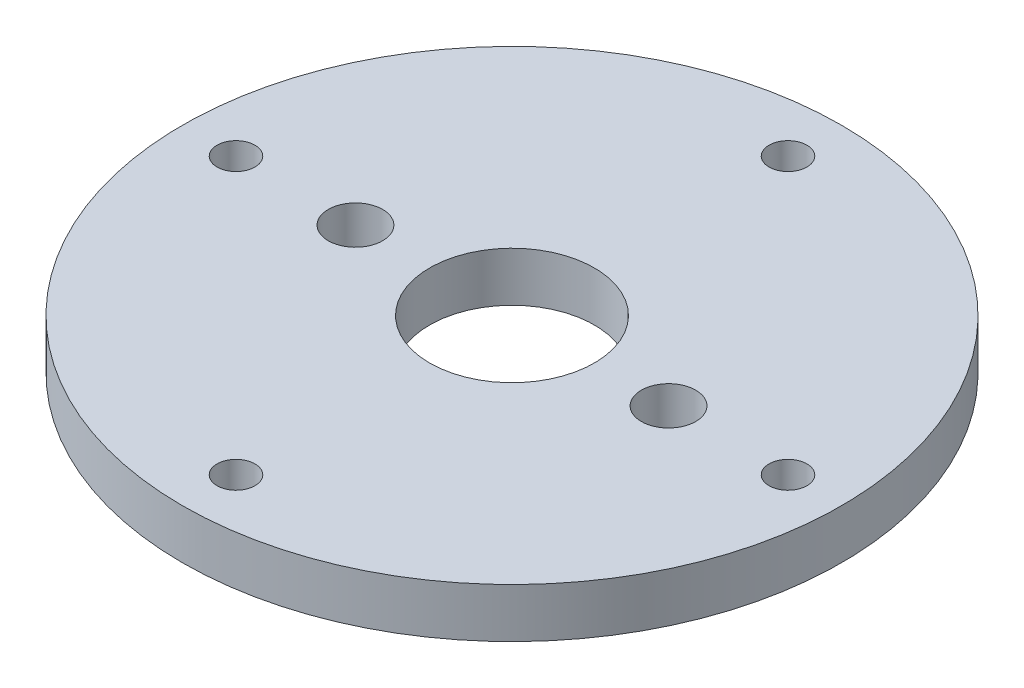
ISO-10303-21;
HEADER;
FILE_DESCRIPTION(('STEP AP214'),'2;1');
FILE_NAME('part.step','',(''),(''),'','','');
FILE_SCHEMA(('AUTOMOTIVE_DESIGN { 1 0 10303 214 1 1 1 1 }'));
ENDSEC;
DATA;
#1=APPLICATION_CONTEXT('core data for automotive mechanical design processes');
#2=APPLICATION_PROTOCOL_DEFINITION('international standard','automotive_design',2000,#1);
#3=PRODUCT_CONTEXT('',#1,'mechanical');
#4=PRODUCT('Part','Part','',(#3));
#5=PRODUCT_RELATED_PRODUCT_CATEGORY('part','',(#4));
#6=PRODUCT_DEFINITION_FORMATION('','',#4);
#7=PRODUCT_DEFINITION_CONTEXT('part definition',#1,'design');
#8=PRODUCT_DEFINITION('design','',#6,#7);
#9=PRODUCT_DEFINITION_SHAPE('','',#8);
#10=(LENGTH_UNIT() NAMED_UNIT(*) SI_UNIT(.MILLI.,.METRE.));
#11=(NAMED_UNIT(*) PLANE_ANGLE_UNIT() SI_UNIT($,.RADIAN.));
#12=(NAMED_UNIT(*) SI_UNIT($,.STERADIAN.) SOLID_ANGLE_UNIT());
#13=UNCERTAINTY_MEASURE_WITH_UNIT(LENGTH_MEASURE(1.E-05),#10,'distance_accuracy_value','');
#14=(GEOMETRIC_REPRESENTATION_CONTEXT(3) GLOBAL_UNCERTAINTY_ASSIGNED_CONTEXT((#13)) GLOBAL_UNIT_ASSIGNED_CONTEXT((#10,
#11,#12)) REPRESENTATION_CONTEXT('',''));
#15=CARTESIAN_POINT('',(0.,0.,0.));
#16=DIRECTION('',(0.,0.,1.));
#17=DIRECTION('',(1.,0.,0.));
#18=AXIS2_PLACEMENT_3D('',#15,#16,#17);
#19=CARTESIAN_POINT('',(0.,3.,0.));
#20=DIRECTION('',(0.,-1.,0.));
#21=DIRECTION('',(0.,0.,-1.));
#22=AXIS2_PLACEMENT_3D('',#19,#20,#21);
#23=CYLINDRICAL_SURFACE('',#22,20.);
#24=CARTESIAN_POINT('',(0.,3.,0.));
#25=DIRECTION('',(0.,1.,0.));
#26=DIRECTION('',(0.,0.,1.));
#27=AXIS2_PLACEMENT_3D('',#24,#25,#26);
#28=CIRCLE('',#27,20.);
#29=CARTESIAN_POINT('',(0.,3.,20.));
#30=VERTEX_POINT('',#29);
#31=EDGE_CURVE('E10',#30,#30,#28,.T.);
#32=ORIENTED_EDGE('',*,*,#31,.F.);
#33=EDGE_LOOP('',(#32));
#34=FACE_BOUND('',#33,.T.);
#35=CARTESIAN_POINT('',(0.,0.,0.));
#36=DIRECTION('',(0.,1.,0.));
#37=DIRECTION('',(0.,0.,1.));
#38=AXIS2_PLACEMENT_3D('',#35,#36,#37);
#39=CIRCLE('',#38,20.);
#40=CARTESIAN_POINT('',(0.,0.,20.));
#41=VERTEX_POINT('',#40);
#42=EDGE_CURVE('E36',#41,#41,#39,.T.);
#43=ORIENTED_EDGE('',*,*,#42,.T.);
#44=EDGE_LOOP('',(#43));
#45=FACE_BOUND('',#44,.T.);
#46=ADVANCED_FACE('F33',(#34,#45),#23,.T.);
#47=CARTESIAN_POINT('',(0.,3.,0.));
#48=DIRECTION('',(0.,1.,0.));
#49=DIRECTION('',(0.,0.,1.));
#50=AXIS2_PLACEMENT_3D('',#47,#48,#49);
#51=PLANE('',#50);
#52=CARTESIAN_POINT('',(-9.5,3.,0.));
#53=DIRECTION('',(0.,1.,0.));
#54=DIRECTION('',(0.,0.,1.));
#55=AXIS2_PLACEMENT_3D('',#52,#53,#54);
#56=CIRCLE('',#55,1.65);
#57=CARTESIAN_POINT('',(-9.5,3.,1.65));
#58=VERTEX_POINT('',#57);
#59=EDGE_CURVE('E79',#58,#58,#56,.T.);
#60=ORIENTED_EDGE('',*,*,#59,.F.);
#61=EDGE_LOOP('',(#60));
#62=FACE_BOUND('',#61,.T.);
#63=CARTESIAN_POINT('',(9.5,3.,0.));
#64=DIRECTION('',(0.,1.,0.));
#65=DIRECTION('',(0.,0.,1.));
#66=AXIS2_PLACEMENT_3D('',#63,#64,#65);
#67=CIRCLE('',#66,1.65);
#68=CARTESIAN_POINT('',(9.5,3.,1.65));
#69=VERTEX_POINT('',#68);
#70=EDGE_CURVE('E72',#69,#69,#67,.T.);
#71=ORIENTED_EDGE('',*,*,#70,.F.);
#72=EDGE_LOOP('',(#71));
#73=FACE_BOUND('',#72,.T.);
#74=CARTESIAN_POINT('',(0.,3.,0.));
#75=DIRECTION('',(0.,1.,0.));
#76=DIRECTION('',(0.,0.,1.));
#77=AXIS2_PLACEMENT_3D('',#74,#75,#76);
#78=CIRCLE('',#77,5.);
#79=CARTESIAN_POINT('',(0.,3.,5.));
#80=VERTEX_POINT('',#79);
#81=EDGE_CURVE('E73',#80,#80,#78,.T.);
#82=ORIENTED_EDGE('',*,*,#81,.F.);
#83=EDGE_LOOP('',(#82));
#84=FACE_BOUND('',#83,.T.);
#85=CARTESIAN_POINT('',(0.,3.,-16.75));
#86=DIRECTION('',(0.,1.,0.));
#87=DIRECTION('',(0.,0.,1.));
#88=AXIS2_PLACEMENT_3D('',#85,#86,#87);
#89=CIRCLE('',#88,1.15);
#90=CARTESIAN_POINT('',(0.,3.,-15.6));
#91=VERTEX_POINT('',#90);
#92=EDGE_CURVE('E62',#91,#91,#89,.T.);
#93=ORIENTED_EDGE('',*,*,#92,.F.);
#94=EDGE_LOOP('',(#93));
#95=FACE_BOUND('',#94,.T.);
#96=CARTESIAN_POINT('',(16.75,3.,0.));
#97=DIRECTION('',(0.,1.,0.));
#98=DIRECTION('',(0.,0.,1.));
#99=AXIS2_PLACEMENT_3D('',#96,#97,#98);
#100=CIRCLE('',#99,1.15);
#101=CARTESIAN_POINT('',(16.75,3.,1.15));
#102=VERTEX_POINT('',#101);
#103=EDGE_CURVE('E56',#102,#102,#100,.T.);
#104=ORIENTED_EDGE('',*,*,#103,.F.);
#105=EDGE_LOOP('',(#104));
#106=FACE_BOUND('',#105,.T.);
#107=CARTESIAN_POINT('',(0.,3.,16.75));
#108=DIRECTION('',(0.,1.,0.));
#109=DIRECTION('',(0.,0.,1.));
#110=AXIS2_PLACEMENT_3D('',#107,#108,#109);
#111=CIRCLE('',#110,1.15);
#112=CARTESIAN_POINT('',(0.,3.,17.9));
#113=VERTEX_POINT('',#112);
#114=EDGE_CURVE('E48',#113,#113,#111,.T.);
#115=ORIENTED_EDGE('',*,*,#114,.F.);
#116=EDGE_LOOP('',(#115));
#117=FACE_BOUND('',#116,.T.);
#118=CARTESIAN_POINT('',(-16.75,3.,0.));
#119=DIRECTION('',(0.,1.,0.));
#120=DIRECTION('',(0.,0.,1.));
#121=AXIS2_PLACEMENT_3D('',#118,#119,#120);
#122=CIRCLE('',#121,1.15);
#123=CARTESIAN_POINT('',(-16.75,3.,1.15));
#124=VERTEX_POINT('',#123);
#125=EDGE_CURVE('E49',#124,#124,#122,.T.);
#126=ORIENTED_EDGE('',*,*,#125,.F.);
#127=EDGE_LOOP('',(#126));
#128=FACE_BOUND('',#127,.T.);
#129=ORIENTED_EDGE('',*,*,#31,.T.);
#130=EDGE_LOOP('',(#129));
#131=FACE_BOUND('',#130,.T.);
#132=ADVANCED_FACE('F90',(#62,#73,#84,#95,#106,#117,#128,#131),#51,.T.);
#133=CARTESIAN_POINT('',(0.,0.,0.));
#134=DIRECTION('',(0.,1.,0.));
#135=DIRECTION('',(0.,0.,1.));
#136=AXIS2_PLACEMENT_3D('',#133,#134,#135);
#137=PLANE('',#136);
#138=CARTESIAN_POINT('',(-9.5,0.,0.));
#139=DIRECTION('',(0.,1.,0.));
#140=DIRECTION('',(0.,0.,1.));
#141=AXIS2_PLACEMENT_3D('',#138,#139,#140);
#142=CIRCLE('',#141,1.65);
#143=CARTESIAN_POINT('',(-9.5,0.,1.65));
#144=VERTEX_POINT('',#143);
#145=EDGE_CURVE('E52',#144,#144,#142,.F.);
#146=ORIENTED_EDGE('',*,*,#145,.F.);
#147=EDGE_LOOP('',(#146));
#148=FACE_BOUND('',#147,.T.);
#149=CARTESIAN_POINT('',(9.5,0.,0.));
#150=DIRECTION('',(0.,1.,0.));
#151=DIRECTION('',(0.,0.,1.));
#152=AXIS2_PLACEMENT_3D('',#149,#150,#151);
#153=CIRCLE('',#152,1.65);
#154=CARTESIAN_POINT('',(9.5,0.,1.65));
#155=VERTEX_POINT('',#154);
#156=EDGE_CURVE('E76',#155,#155,#153,.F.);
#157=ORIENTED_EDGE('',*,*,#156,.F.);
#158=EDGE_LOOP('',(#157));
#159=FACE_BOUND('',#158,.T.);
#160=CARTESIAN_POINT('',(0.,0.,0.));
#161=DIRECTION('',(0.,1.,0.));
#162=DIRECTION('',(0.,0.,1.));
#163=AXIS2_PLACEMENT_3D('',#160,#161,#162);
#164=CIRCLE('',#163,5.);
#165=CARTESIAN_POINT('',(0.,0.,5.));
#166=VERTEX_POINT('',#165);
#167=EDGE_CURVE('E69',#166,#166,#164,.F.);
#168=ORIENTED_EDGE('',*,*,#167,.F.);
#169=EDGE_LOOP('',(#168));
#170=FACE_BOUND('',#169,.T.);
#171=CARTESIAN_POINT('',(0.,0.,-16.75));
#172=DIRECTION('',(0.,1.,0.));
#173=DIRECTION('',(0.,0.,1.));
#174=AXIS2_PLACEMENT_3D('',#171,#172,#173);
#175=CIRCLE('',#174,1.15);
#176=CARTESIAN_POINT('',(0.,0.,-15.6));
#177=VERTEX_POINT('',#176);
#178=EDGE_CURVE('E43',#177,#177,#175,.F.);
#179=ORIENTED_EDGE('',*,*,#178,.F.);
#180=EDGE_LOOP('',(#179));
#181=FACE_BOUND('',#180,.T.);
#182=CARTESIAN_POINT('',(16.75,0.,0.));
#183=DIRECTION('',(0.,1.,0.));
#184=DIRECTION('',(0.,0.,1.));
#185=AXIS2_PLACEMENT_3D('',#182,#183,#184);
#186=CIRCLE('',#185,1.15);
#187=CARTESIAN_POINT('',(16.75,0.,1.15));
#188=VERTEX_POINT('',#187);
#189=EDGE_CURVE('E59',#188,#188,#186,.F.);
#190=ORIENTED_EDGE('',*,*,#189,.F.);
#191=EDGE_LOOP('',(#190));
#192=FACE_BOUND('',#191,.T.);
#193=CARTESIAN_POINT('',(0.,0.,16.75));
#194=DIRECTION('',(0.,1.,0.));
#195=DIRECTION('',(0.,0.,1.));
#196=AXIS2_PLACEMENT_3D('',#193,#194,#195);
#197=CIRCLE('',#196,1.15);
#198=CARTESIAN_POINT('',(0.,0.,17.9));
#199=VERTEX_POINT('',#198);
#200=EDGE_CURVE('E53',#199,#199,#197,.F.);
#201=ORIENTED_EDGE('',*,*,#200,.F.);
#202=EDGE_LOOP('',(#201));
#203=FACE_BOUND('',#202,.T.);
#204=CARTESIAN_POINT('',(-16.75,0.,0.));
#205=DIRECTION('',(0.,1.,0.));
#206=DIRECTION('',(0.,0.,1.));
#207=AXIS2_PLACEMENT_3D('',#204,#205,#206);
#208=CIRCLE('',#207,1.15);
#209=CARTESIAN_POINT('',(-16.75,0.,1.15));
#210=VERTEX_POINT('',#209);
#211=EDGE_CURVE('E45',#210,#210,#208,.F.);
#212=ORIENTED_EDGE('',*,*,#211,.F.);
#213=EDGE_LOOP('',(#212));
#214=FACE_BOUND('',#213,.T.);
#215=ORIENTED_EDGE('',*,*,#42,.F.);
#216=EDGE_LOOP('',(#215));
#217=FACE_BOUND('',#216,.T.);
#218=ADVANCED_FACE('F93',(#148,#159,#170,#181,#192,#203,#214,#217),#137,.F.);
#219=CARTESIAN_POINT('',(-16.75,-0.00100000000000013,0.));
#220=DIRECTION('',(0.,1.,0.));
#221=DIRECTION('',(0.,0.,1.));
#222=AXIS2_PLACEMENT_3D('',#219,#220,#221);
#223=CYLINDRICAL_SURFACE('',#222,1.15);
#224=CARTESIAN_POINT('',(-16.75,3.,1.15));
#225=CARTESIAN_POINT('',(-16.75,2.96875,1.15));
#226=CARTESIAN_POINT('',(-16.75,2.9375,1.15));
#227=CARTESIAN_POINT('',(-16.75,2.875,1.15));
#228=CARTESIAN_POINT('',(-16.75,2.84375,1.15));
#229=CARTESIAN_POINT('',(-16.75,2.78125,1.15));
#230=CARTESIAN_POINT('',(-16.75,2.75,1.15));
#231=CARTESIAN_POINT('',(-16.75,2.6875,1.15));
#232=CARTESIAN_POINT('',(-16.75,2.65625,1.15));
#233=CARTESIAN_POINT('',(-16.75,2.59375,1.15));
#234=CARTESIAN_POINT('',(-16.75,2.5625,1.15));
#235=CARTESIAN_POINT('',(-16.75,2.5,1.15));
#236=CARTESIAN_POINT('',(-16.75,2.46875,1.15));
#237=CARTESIAN_POINT('',(-16.75,2.40625,1.15));
#238=CARTESIAN_POINT('',(-16.75,2.375,1.15));
#239=CARTESIAN_POINT('',(-16.75,2.3125,1.15));
#240=CARTESIAN_POINT('',(-16.75,2.28125,1.15));
#241=CARTESIAN_POINT('',(-16.75,2.21875,1.15));
#242=CARTESIAN_POINT('',(-16.75,2.1875,1.15));
#243=CARTESIAN_POINT('',(-16.75,2.125,1.15));
#244=CARTESIAN_POINT('',(-16.75,2.09375,1.15));
#245=CARTESIAN_POINT('',(-16.75,2.03125,1.15));
#246=CARTESIAN_POINT('',(-16.75,2.,1.15));
#247=CARTESIAN_POINT('',(-16.75,1.9375,1.15));
#248=CARTESIAN_POINT('',(-16.75,1.90625,1.15));
#249=CARTESIAN_POINT('',(-16.75,1.84375,1.15));
#250=CARTESIAN_POINT('',(-16.75,1.8125,1.15));
#251=CARTESIAN_POINT('',(-16.75,1.75,1.15));
#252=CARTESIAN_POINT('',(-16.75,1.71875,1.15));
#253=CARTESIAN_POINT('',(-16.75,1.65625,1.15));
#254=CARTESIAN_POINT('',(-16.75,1.625,1.15));
#255=CARTESIAN_POINT('',(-16.75,1.5625,1.15));
#256=CARTESIAN_POINT('',(-16.75,1.53125,1.15));
#257=CARTESIAN_POINT('',(-16.75,1.46875,1.15));
#258=CARTESIAN_POINT('',(-16.75,1.4375,1.15));
#259=CARTESIAN_POINT('',(-16.75,1.375,1.15));
#260=CARTESIAN_POINT('',(-16.75,1.34375,1.15));
#261=CARTESIAN_POINT('',(-16.75,1.28125,1.15));
#262=CARTESIAN_POINT('',(-16.75,1.25,1.15));
#263=CARTESIAN_POINT('',(-16.75,1.1875,1.15));
#264=CARTESIAN_POINT('',(-16.75,1.15625,1.15));
#265=CARTESIAN_POINT('',(-16.75,1.09375,1.15));
#266=CARTESIAN_POINT('',(-16.75,1.0625,1.15));
#267=CARTESIAN_POINT('',(-16.75,1.,1.15));
#268=CARTESIAN_POINT('',(-16.75,0.96875,1.15));
#269=CARTESIAN_POINT('',(-16.75,0.90625,1.15));
#270=CARTESIAN_POINT('',(-16.75,0.875,1.15));
#271=CARTESIAN_POINT('',(-16.75,0.8125,1.15));
#272=CARTESIAN_POINT('',(-16.75,0.78125,1.15));
#273=CARTESIAN_POINT('',(-16.75,0.71875,1.15));
#274=CARTESIAN_POINT('',(-16.75,0.6875,1.15));
#275=CARTESIAN_POINT('',(-16.75,0.625,1.15));
#276=CARTESIAN_POINT('',(-16.75,0.59375,1.15));
#277=CARTESIAN_POINT('',(-16.75,0.53125,1.15));
#278=CARTESIAN_POINT('',(-16.75,0.5,1.15));
#279=CARTESIAN_POINT('',(-16.75,0.4375,1.15));
#280=CARTESIAN_POINT('',(-16.75,0.40625,1.15));
#281=CARTESIAN_POINT('',(-16.75,0.34375,1.15));
#282=CARTESIAN_POINT('',(-16.75,0.3125,1.15));
#283=CARTESIAN_POINT('',(-16.75,0.25,1.15));
#284=CARTESIAN_POINT('',(-16.75,0.21875,1.15));
#285=CARTESIAN_POINT('',(-16.75,0.15625,1.15));
#286=CARTESIAN_POINT('',(-16.75,0.125,1.15));
#287=CARTESIAN_POINT('',(-16.75,0.0625000000000001,1.15));
#288=CARTESIAN_POINT('',(-16.75,0.0312500000000001,1.15));
#289=CARTESIAN_POINT('',(-16.75,0.,1.15));
#290=B_SPLINE_CURVE_WITH_KNOTS('',3,(#224,#225,#226,#227,#228,#229,#230,#231,#232,#233,#234,
#235,#236,#237,#238,#239,#240,#241,#242,#243,#244,#245,#246,#247,#248,#249,#250,#251,#252,#253,
#254,#255,#256,#257,#258,#259,#260,#261,#262,#263,#264,#265,#266,#267,#268,#269,#270,#271,#272,
#273,#274,#275,#276,#277,#278,#279,#280,#281,#282,#283,#284,#285,#286,#287,#288,#289),
.UNSPECIFIED.,.F.,.F.,(4,2,2,2,2,2,2,2,2,2,2,2,2,2,2,2,2,2,2,2,2,2,2,2,2,2,2,2,2,2,2,2,4),(0.,
0.0937500000000001,0.1875,0.28125,0.375,0.46875,0.5625,0.65625,0.75,0.84375,0.9375,1.03125,
1.125,1.21875,1.3125,1.40625,1.5,1.59375,1.6875,1.78125,1.875,1.96875,2.0625,2.15625,2.25,
2.34375,2.4375,2.53125,2.625,2.71875,2.8125,2.90625,3.),.UNSPECIFIED.);
#291=EDGE_CURVE('BSEAM107',#124,#210,#290,.T.);
#292=ORIENTED_EDGE('',*,*,#125,.T.);
#293=ORIENTED_EDGE('',*,*,#211,.T.);
#294=ORIENTED_EDGE('',*,*,#291,.T.);
#295=ORIENTED_EDGE('',*,*,#291,.F.);
#296=EDGE_LOOP('',(#292,#294,#293,#295));
#297=FACE_BOUND('',#296,.T.);
#298=ADVANCED_FACE('F107',(#297),#223,.F.);
#299=CARTESIAN_POINT('',(0.,-0.00100000000000013,16.75));
#300=DIRECTION('',(0.,1.,0.));
#301=DIRECTION('',(0.,0.,1.));
#302=AXIS2_PLACEMENT_3D('',#299,#300,#301);
#303=CYLINDRICAL_SURFACE('',#302,1.15);
#304=CARTESIAN_POINT('',(0.,3.,17.9));
#305=CARTESIAN_POINT('',(0.,2.96875,17.9));
#306=CARTESIAN_POINT('',(0.,2.9375,17.9));
#307=CARTESIAN_POINT('',(0.,2.875,17.9));
#308=CARTESIAN_POINT('',(0.,2.84375,17.9));
#309=CARTESIAN_POINT('',(0.,2.78125,17.9));
#310=CARTESIAN_POINT('',(0.,2.75,17.9));
#311=CARTESIAN_POINT('',(0.,2.6875,17.9));
#312=CARTESIAN_POINT('',(0.,2.65625,17.9));
#313=CARTESIAN_POINT('',(0.,2.59375,17.9));
#314=CARTESIAN_POINT('',(0.,2.5625,17.9));
#315=CARTESIAN_POINT('',(0.,2.5,17.9));
#316=CARTESIAN_POINT('',(0.,2.46875,17.9));
#317=CARTESIAN_POINT('',(0.,2.40625,17.9));
#318=CARTESIAN_POINT('',(0.,2.375,17.9));
#319=CARTESIAN_POINT('',(0.,2.3125,17.9));
#320=CARTESIAN_POINT('',(0.,2.28125,17.9));
#321=CARTESIAN_POINT('',(0.,2.21875,17.9));
#322=CARTESIAN_POINT('',(0.,2.1875,17.9));
#323=CARTESIAN_POINT('',(0.,2.125,17.9));
#324=CARTESIAN_POINT('',(0.,2.09375,17.9));
#325=CARTESIAN_POINT('',(0.,2.03125,17.9));
#326=CARTESIAN_POINT('',(0.,2.,17.9));
#327=CARTESIAN_POINT('',(0.,1.9375,17.9));
#328=CARTESIAN_POINT('',(0.,1.90625,17.9));
#329=CARTESIAN_POINT('',(0.,1.84375,17.9));
#330=CARTESIAN_POINT('',(0.,1.8125,17.9));
#331=CARTESIAN_POINT('',(0.,1.75,17.9));
#332=CARTESIAN_POINT('',(0.,1.71875,17.9));
#333=CARTESIAN_POINT('',(0.,1.65625,17.9));
#334=CARTESIAN_POINT('',(0.,1.625,17.9));
#335=CARTESIAN_POINT('',(0.,1.5625,17.9));
#336=CARTESIAN_POINT('',(0.,1.53125,17.9));
#337=CARTESIAN_POINT('',(0.,1.46875,17.9));
#338=CARTESIAN_POINT('',(0.,1.4375,17.9));
#339=CARTESIAN_POINT('',(0.,1.375,17.9));
#340=CARTESIAN_POINT('',(0.,1.34375,17.9));
#341=CARTESIAN_POINT('',(0.,1.28125,17.9));
#342=CARTESIAN_POINT('',(0.,1.25,17.9));
#343=CARTESIAN_POINT('',(0.,1.1875,17.9));
#344=CARTESIAN_POINT('',(0.,1.15625,17.9));
#345=CARTESIAN_POINT('',(0.,1.09375,17.9));
#346=CARTESIAN_POINT('',(0.,1.0625,17.9));
#347=CARTESIAN_POINT('',(0.,1.,17.9));
#348=CARTESIAN_POINT('',(0.,0.96875,17.9));
#349=CARTESIAN_POINT('',(0.,0.90625,17.9));
#350=CARTESIAN_POINT('',(0.,0.875,17.9));
#351=CARTESIAN_POINT('',(0.,0.8125,17.9));
#352=CARTESIAN_POINT('',(0.,0.78125,17.9));
#353=CARTESIAN_POINT('',(0.,0.71875,17.9));
#354=CARTESIAN_POINT('',(0.,0.6875,17.9));
#355=CARTESIAN_POINT('',(0.,0.625,17.9));
#356=CARTESIAN_POINT('',(0.,0.59375,17.9));
#357=CARTESIAN_POINT('',(0.,0.53125,17.9));
#358=CARTESIAN_POINT('',(0.,0.5,17.9));
#359=CARTESIAN_POINT('',(0.,0.4375,17.9));
#360=CARTESIAN_POINT('',(0.,0.40625,17.9));
#361=CARTESIAN_POINT('',(0.,0.34375,17.9));
#362=CARTESIAN_POINT('',(0.,0.3125,17.9));
#363=CARTESIAN_POINT('',(0.,0.25,17.9));
#364=CARTESIAN_POINT('',(0.,0.21875,17.9));
#365=CARTESIAN_POINT('',(0.,0.15625,17.9));
#366=CARTESIAN_POINT('',(0.,0.125,17.9));
#367=CARTESIAN_POINT('',(0.,0.0625000000000001,17.9));
#368=CARTESIAN_POINT('',(0.,0.0312500000000001,17.9));
#369=CARTESIAN_POINT('',(0.,0.,17.9));
#370=B_SPLINE_CURVE_WITH_KNOTS('',3,(#304,#305,#306,#307,#308,#309,#310,#311,#312,#313,#314,
#315,#316,#317,#318,#319,#320,#321,#322,#323,#324,#325,#326,#327,#328,#329,#330,#331,#332,#333,
#334,#335,#336,#337,#338,#339,#340,#341,#342,#343,#344,#345,#346,#347,#348,#349,#350,#351,#352,
#353,#354,#355,#356,#357,#358,#359,#360,#361,#362,#363,#364,#365,#366,#367,#368,#369),
.UNSPECIFIED.,.F.,.F.,(4,2,2,2,2,2,2,2,2,2,2,2,2,2,2,2,2,2,2,2,2,2,2,2,2,2,2,2,2,2,2,2,4),(0.,
0.0937500000000001,0.1875,0.28125,0.375,0.46875,0.5625,0.65625,0.75,0.84375,0.9375,1.03125,
1.125,1.21875,1.3125,1.40625,1.5,1.59375,1.6875,1.78125,1.875,1.96875,2.0625,2.15625,2.25,
2.34375,2.4375,2.53125,2.625,2.71875,2.8125,2.90625,3.),.UNSPECIFIED.);
#371=EDGE_CURVE('BSEAM110',#113,#199,#370,.T.);
#372=ORIENTED_EDGE('',*,*,#114,.T.);
#373=ORIENTED_EDGE('',*,*,#200,.T.);
#374=ORIENTED_EDGE('',*,*,#371,.T.);
#375=ORIENTED_EDGE('',*,*,#371,.F.);
#376=EDGE_LOOP('',(#372,#374,#373,#375));
#377=FACE_BOUND('',#376,.T.);
#378=ADVANCED_FACE('F110',(#377),#303,.F.);
#379=CARTESIAN_POINT('',(16.75,-0.00100000000000013,0.));
#380=DIRECTION('',(0.,1.,0.));
#381=DIRECTION('',(0.,0.,1.));
#382=AXIS2_PLACEMENT_3D('',#379,#380,#381);
#383=CYLINDRICAL_SURFACE('',#382,1.15);
#384=CARTESIAN_POINT('',(16.75,3.,1.15));
#385=CARTESIAN_POINT('',(16.75,2.96875,1.15));
#386=CARTESIAN_POINT('',(16.75,2.9375,1.15));
#387=CARTESIAN_POINT('',(16.75,2.875,1.15));
#388=CARTESIAN_POINT('',(16.75,2.84375,1.15));
#389=CARTESIAN_POINT('',(16.75,2.78125,1.15));
#390=CARTESIAN_POINT('',(16.75,2.75,1.15));
#391=CARTESIAN_POINT('',(16.75,2.6875,1.15));
#392=CARTESIAN_POINT('',(16.75,2.65625,1.15));
#393=CARTESIAN_POINT('',(16.75,2.59375,1.15));
#394=CARTESIAN_POINT('',(16.75,2.5625,1.15));
#395=CARTESIAN_POINT('',(16.75,2.5,1.15));
#396=CARTESIAN_POINT('',(16.75,2.46875,1.15));
#397=CARTESIAN_POINT('',(16.75,2.40625,1.15));
#398=CARTESIAN_POINT('',(16.75,2.375,1.15));
#399=CARTESIAN_POINT('',(16.75,2.3125,1.15));
#400=CARTESIAN_POINT('',(16.75,2.28125,1.15));
#401=CARTESIAN_POINT('',(16.75,2.21875,1.15));
#402=CARTESIAN_POINT('',(16.75,2.1875,1.15));
#403=CARTESIAN_POINT('',(16.75,2.125,1.15));
#404=CARTESIAN_POINT('',(16.75,2.09375,1.15));
#405=CARTESIAN_POINT('',(16.75,2.03125,1.15));
#406=CARTESIAN_POINT('',(16.75,2.,1.15));
#407=CARTESIAN_POINT('',(16.75,1.9375,1.15));
#408=CARTESIAN_POINT('',(16.75,1.90625,1.15));
#409=CARTESIAN_POINT('',(16.75,1.84375,1.15));
#410=CARTESIAN_POINT('',(16.75,1.8125,1.15));
#411=CARTESIAN_POINT('',(16.75,1.75,1.15));
#412=CARTESIAN_POINT('',(16.75,1.71875,1.15));
#413=CARTESIAN_POINT('',(16.75,1.65625,1.15));
#414=CARTESIAN_POINT('',(16.75,1.625,1.15));
#415=CARTESIAN_POINT('',(16.75,1.5625,1.15));
#416=CARTESIAN_POINT('',(16.75,1.53125,1.15));
#417=CARTESIAN_POINT('',(16.75,1.46875,1.15));
#418=CARTESIAN_POINT('',(16.75,1.4375,1.15));
#419=CARTESIAN_POINT('',(16.75,1.375,1.15));
#420=CARTESIAN_POINT('',(16.75,1.34375,1.15));
#421=CARTESIAN_POINT('',(16.75,1.28125,1.15));
#422=CARTESIAN_POINT('',(16.75,1.25,1.15));
#423=CARTESIAN_POINT('',(16.75,1.1875,1.15));
#424=CARTESIAN_POINT('',(16.75,1.15625,1.15));
#425=CARTESIAN_POINT('',(16.75,1.09375,1.15));
#426=CARTESIAN_POINT('',(16.75,1.0625,1.15));
#427=CARTESIAN_POINT('',(16.75,1.,1.15));
#428=CARTESIAN_POINT('',(16.75,0.96875,1.15));
#429=CARTESIAN_POINT('',(16.75,0.90625,1.15));
#430=CARTESIAN_POINT('',(16.75,0.875,1.15));
#431=CARTESIAN_POINT('',(16.75,0.8125,1.15));
#432=CARTESIAN_POINT('',(16.75,0.78125,1.15));
#433=CARTESIAN_POINT('',(16.75,0.71875,1.15));
#434=CARTESIAN_POINT('',(16.75,0.6875,1.15));
#435=CARTESIAN_POINT('',(16.75,0.625,1.15));
#436=CARTESIAN_POINT('',(16.75,0.59375,1.15));
#437=CARTESIAN_POINT('',(16.75,0.53125,1.15));
#438=CARTESIAN_POINT('',(16.75,0.5,1.15));
#439=CARTESIAN_POINT('',(16.75,0.4375,1.15));
#440=CARTESIAN_POINT('',(16.75,0.40625,1.15));
#441=CARTESIAN_POINT('',(16.75,0.34375,1.15));
#442=CARTESIAN_POINT('',(16.75,0.3125,1.15));
#443=CARTESIAN_POINT('',(16.75,0.25,1.15));
#444=CARTESIAN_POINT('',(16.75,0.21875,1.15));
#445=CARTESIAN_POINT('',(16.75,0.15625,1.15));
#446=CARTESIAN_POINT('',(16.75,0.125,1.15));
#447=CARTESIAN_POINT('',(16.75,0.0625000000000001,1.15));
#448=CARTESIAN_POINT('',(16.75,0.0312500000000001,1.15));
#449=CARTESIAN_POINT('',(16.75,0.,1.15));
#450=B_SPLINE_CURVE_WITH_KNOTS('',3,(#384,#385,#386,#387,#388,#389,#390,#391,#392,#393,#394,
#395,#396,#397,#398,#399,#400,#401,#402,#403,#404,#405,#406,#407,#408,#409,#410,#411,#412,#413,
#414,#415,#416,#417,#418,#419,#420,#421,#422,#423,#424,#425,#426,#427,#428,#429,#430,#431,#432,
#433,#434,#435,#436,#437,#438,#439,#440,#441,#442,#443,#444,#445,#446,#447,#448,#449),
.UNSPECIFIED.,.F.,.F.,(4,2,2,2,2,2,2,2,2,2,2,2,2,2,2,2,2,2,2,2,2,2,2,2,2,2,2,2,2,2,2,2,4),(0.,
0.0937500000000001,0.1875,0.28125,0.375,0.46875,0.5625,0.65625,0.75,0.84375,0.9375,1.03125,
1.125,1.21875,1.3125,1.40625,1.5,1.59375,1.6875,1.78125,1.875,1.96875,2.0625,2.15625,2.25,
2.34375,2.4375,2.53125,2.625,2.71875,2.8125,2.90625,3.),.UNSPECIFIED.);
#451=EDGE_CURVE('BSEAM143',#102,#188,#450,.T.);
#452=ORIENTED_EDGE('',*,*,#103,.T.);
#453=ORIENTED_EDGE('',*,*,#189,.T.);
#454=ORIENTED_EDGE('',*,*,#451,.T.);
#455=ORIENTED_EDGE('',*,*,#451,.F.);
#456=EDGE_LOOP('',(#452,#454,#453,#455));
#457=FACE_BOUND('',#456,.T.);
#458=ADVANCED_FACE('F143',(#457),#383,.F.);
#459=CARTESIAN_POINT('',(0.,-0.00100000000000013,-16.75));
#460=DIRECTION('',(0.,1.,0.));
#461=DIRECTION('',(0.,0.,1.));
#462=AXIS2_PLACEMENT_3D('',#459,#460,#461);
#463=CYLINDRICAL_SURFACE('',#462,1.15);
#464=CARTESIAN_POINT('',(0.,3.,-15.6));
#465=CARTESIAN_POINT('',(0.,2.96875,-15.6));
#466=CARTESIAN_POINT('',(0.,2.9375,-15.6));
#467=CARTESIAN_POINT('',(0.,2.875,-15.6));
#468=CARTESIAN_POINT('',(0.,2.84375,-15.6));
#469=CARTESIAN_POINT('',(0.,2.78125,-15.6));
#470=CARTESIAN_POINT('',(0.,2.75,-15.6));
#471=CARTESIAN_POINT('',(0.,2.6875,-15.6));
#472=CARTESIAN_POINT('',(0.,2.65625,-15.6));
#473=CARTESIAN_POINT('',(0.,2.59375,-15.6));
#474=CARTESIAN_POINT('',(0.,2.5625,-15.6));
#475=CARTESIAN_POINT('',(0.,2.5,-15.6));
#476=CARTESIAN_POINT('',(0.,2.46875,-15.6));
#477=CARTESIAN_POINT('',(0.,2.40625,-15.6));
#478=CARTESIAN_POINT('',(0.,2.375,-15.6));
#479=CARTESIAN_POINT('',(0.,2.3125,-15.6));
#480=CARTESIAN_POINT('',(0.,2.28125,-15.6));
#481=CARTESIAN_POINT('',(0.,2.21875,-15.6));
#482=CARTESIAN_POINT('',(0.,2.1875,-15.6));
#483=CARTESIAN_POINT('',(0.,2.125,-15.6));
#484=CARTESIAN_POINT('',(0.,2.09375,-15.6));
#485=CARTESIAN_POINT('',(0.,2.03125,-15.6));
#486=CARTESIAN_POINT('',(0.,2.,-15.6));
#487=CARTESIAN_POINT('',(0.,1.9375,-15.6));
#488=CARTESIAN_POINT('',(0.,1.90625,-15.6));
#489=CARTESIAN_POINT('',(0.,1.84375,-15.6));
#490=CARTESIAN_POINT('',(0.,1.8125,-15.6));
#491=CARTESIAN_POINT('',(0.,1.75,-15.6));
#492=CARTESIAN_POINT('',(0.,1.71875,-15.6));
#493=CARTESIAN_POINT('',(0.,1.65625,-15.6));
#494=CARTESIAN_POINT('',(0.,1.625,-15.6));
#495=CARTESIAN_POINT('',(0.,1.5625,-15.6));
#496=CARTESIAN_POINT('',(0.,1.53125,-15.6));
#497=CARTESIAN_POINT('',(0.,1.46875,-15.6));
#498=CARTESIAN_POINT('',(0.,1.4375,-15.6));
#499=CARTESIAN_POINT('',(0.,1.375,-15.6));
#500=CARTESIAN_POINT('',(0.,1.34375,-15.6));
#501=CARTESIAN_POINT('',(0.,1.28125,-15.6));
#502=CARTESIAN_POINT('',(0.,1.25,-15.6));
#503=CARTESIAN_POINT('',(0.,1.1875,-15.6));
#504=CARTESIAN_POINT('',(0.,1.15625,-15.6));
#505=CARTESIAN_POINT('',(0.,1.09375,-15.6));
#506=CARTESIAN_POINT('',(0.,1.0625,-15.6));
#507=CARTESIAN_POINT('',(0.,1.,-15.6));
#508=CARTESIAN_POINT('',(0.,0.96875,-15.6));
#509=CARTESIAN_POINT('',(0.,0.90625,-15.6));
#510=CARTESIAN_POINT('',(0.,0.875,-15.6));
#511=CARTESIAN_POINT('',(0.,0.8125,-15.6));
#512=CARTESIAN_POINT('',(0.,0.78125,-15.6));
#513=CARTESIAN_POINT('',(0.,0.71875,-15.6));
#514=CARTESIAN_POINT('',(0.,0.6875,-15.6));
#515=CARTESIAN_POINT('',(0.,0.625,-15.6));
#516=CARTESIAN_POINT('',(0.,0.59375,-15.6));
#517=CARTESIAN_POINT('',(0.,0.53125,-15.6));
#518=CARTESIAN_POINT('',(0.,0.5,-15.6));
#519=CARTESIAN_POINT('',(0.,0.4375,-15.6));
#520=CARTESIAN_POINT('',(0.,0.40625,-15.6));
#521=CARTESIAN_POINT('',(0.,0.34375,-15.6));
#522=CARTESIAN_POINT('',(0.,0.3125,-15.6));
#523=CARTESIAN_POINT('',(0.,0.25,-15.6));
#524=CARTESIAN_POINT('',(0.,0.21875,-15.6));
#525=CARTESIAN_POINT('',(0.,0.15625,-15.6));
#526=CARTESIAN_POINT('',(0.,0.125,-15.6));
#527=CARTESIAN_POINT('',(0.,0.0625000000000001,-15.6));
#528=CARTESIAN_POINT('',(0.,0.0312500000000001,-15.6));
#529=CARTESIAN_POINT('',(0.,0.,-15.6));
#530=B_SPLINE_CURVE_WITH_KNOTS('',3,(#464,#465,#466,#467,#468,#469,#470,#471,#472,#473,#474,
#475,#476,#477,#478,#479,#480,#481,#482,#483,#484,#485,#486,#487,#488,#489,#490,#491,#492,#493,
#494,#495,#496,#497,#498,#499,#500,#501,#502,#503,#504,#505,#506,#507,#508,#509,#510,#511,#512,
#513,#514,#515,#516,#517,#518,#519,#520,#521,#522,#523,#524,#525,#526,#527,#528,#529),
.UNSPECIFIED.,.F.,.F.,(4,2,2,2,2,2,2,2,2,2,2,2,2,2,2,2,2,2,2,2,2,2,2,2,2,2,2,2,2,2,2,2,4),(0.,
0.0937500000000001,0.1875,0.28125,0.375,0.46875,0.5625,0.65625,0.75,0.84375,0.9375,1.03125,
1.125,1.21875,1.3125,1.40625,1.5,1.59375,1.6875,1.78125,1.875,1.96875,2.0625,2.15625,2.25,
2.34375,2.4375,2.53125,2.625,2.71875,2.8125,2.90625,3.),.UNSPECIFIED.);
#531=EDGE_CURVE('BSEAM151',#91,#177,#530,.T.);
#532=ORIENTED_EDGE('',*,*,#92,.T.);
#533=ORIENTED_EDGE('',*,*,#178,.T.);
#534=ORIENTED_EDGE('',*,*,#531,.T.);
#535=ORIENTED_EDGE('',*,*,#531,.F.);
#536=EDGE_LOOP('',(#532,#534,#533,#535));
#537=FACE_BOUND('',#536,.T.);
#538=ADVANCED_FACE('F151',(#537),#463,.F.);
#539=CARTESIAN_POINT('',(0.,-0.00100000000000013,0.));
#540=DIRECTION('',(0.,1.,0.));
#541=DIRECTION('',(0.,0.,1.));
#542=AXIS2_PLACEMENT_3D('',#539,#540,#541);
#543=CYLINDRICAL_SURFACE('',#542,5.);
#544=CARTESIAN_POINT('',(0.,3.,5.));
#545=CARTESIAN_POINT('',(0.,2.96875,5.));
#546=CARTESIAN_POINT('',(0.,2.9375,5.));
#547=CARTESIAN_POINT('',(0.,2.875,5.));
#548=CARTESIAN_POINT('',(0.,2.84375,5.));
#549=CARTESIAN_POINT('',(0.,2.78125,5.));
#550=CARTESIAN_POINT('',(0.,2.75,5.));
#551=CARTESIAN_POINT('',(0.,2.6875,5.));
#552=CARTESIAN_POINT('',(0.,2.65625,5.));
#553=CARTESIAN_POINT('',(0.,2.59375,5.));
#554=CARTESIAN_POINT('',(0.,2.5625,5.));
#555=CARTESIAN_POINT('',(0.,2.5,5.));
#556=CARTESIAN_POINT('',(0.,2.46875,5.));
#557=CARTESIAN_POINT('',(0.,2.40625,5.));
#558=CARTESIAN_POINT('',(0.,2.375,5.));
#559=CARTESIAN_POINT('',(0.,2.3125,5.));
#560=CARTESIAN_POINT('',(0.,2.28125,5.));
#561=CARTESIAN_POINT('',(0.,2.21875,5.));
#562=CARTESIAN_POINT('',(0.,2.1875,5.));
#563=CARTESIAN_POINT('',(0.,2.125,5.));
#564=CARTESIAN_POINT('',(0.,2.09375,5.));
#565=CARTESIAN_POINT('',(0.,2.03125,5.));
#566=CARTESIAN_POINT('',(0.,2.,5.));
#567=CARTESIAN_POINT('',(0.,1.9375,5.));
#568=CARTESIAN_POINT('',(0.,1.90625,5.));
#569=CARTESIAN_POINT('',(0.,1.84375,5.));
#570=CARTESIAN_POINT('',(0.,1.8125,5.));
#571=CARTESIAN_POINT('',(0.,1.75,5.));
#572=CARTESIAN_POINT('',(0.,1.71875,5.));
#573=CARTESIAN_POINT('',(0.,1.65625,5.));
#574=CARTESIAN_POINT('',(0.,1.625,5.));
#575=CARTESIAN_POINT('',(0.,1.5625,5.));
#576=CARTESIAN_POINT('',(0.,1.53125,5.));
#577=CARTESIAN_POINT('',(0.,1.46875,5.));
#578=CARTESIAN_POINT('',(0.,1.4375,5.));
#579=CARTESIAN_POINT('',(0.,1.375,5.));
#580=CARTESIAN_POINT('',(0.,1.34375,5.));
#581=CARTESIAN_POINT('',(0.,1.28125,5.));
#582=CARTESIAN_POINT('',(0.,1.25,5.));
#583=CARTESIAN_POINT('',(0.,1.1875,5.));
#584=CARTESIAN_POINT('',(0.,1.15625,5.));
#585=CARTESIAN_POINT('',(0.,1.09375,5.));
#586=CARTESIAN_POINT('',(0.,1.0625,5.));
#587=CARTESIAN_POINT('',(0.,1.,5.));
#588=CARTESIAN_POINT('',(0.,0.96875,5.));
#589=CARTESIAN_POINT('',(0.,0.90625,5.));
#590=CARTESIAN_POINT('',(0.,0.875,5.));
#591=CARTESIAN_POINT('',(0.,0.8125,5.));
#592=CARTESIAN_POINT('',(0.,0.78125,5.));
#593=CARTESIAN_POINT('',(0.,0.71875,5.));
#594=CARTESIAN_POINT('',(0.,0.6875,5.));
#595=CARTESIAN_POINT('',(0.,0.625,5.));
#596=CARTESIAN_POINT('',(0.,0.59375,5.));
#597=CARTESIAN_POINT('',(0.,0.53125,5.));
#598=CARTESIAN_POINT('',(0.,0.5,5.));
#599=CARTESIAN_POINT('',(0.,0.4375,5.));
#600=CARTESIAN_POINT('',(0.,0.40625,5.));
#601=CARTESIAN_POINT('',(0.,0.34375,5.));
#602=CARTESIAN_POINT('',(0.,0.3125,5.));
#603=CARTESIAN_POINT('',(0.,0.25,5.));
#604=CARTESIAN_POINT('',(0.,0.21875,5.));
#605=CARTESIAN_POINT('',(0.,0.15625,5.));
#606=CARTESIAN_POINT('',(0.,0.125,5.));
#607=CARTESIAN_POINT('',(0.,0.0625000000000001,5.));
#608=CARTESIAN_POINT('',(0.,0.0312500000000001,5.));
#609=CARTESIAN_POINT('',(0.,0.,5.));
#610=B_SPLINE_CURVE_WITH_KNOTS('',3,(#544,#545,#546,#547,#548,#549,#550,#551,#552,#553,#554,
#555,#556,#557,#558,#559,#560,#561,#562,#563,#564,#565,#566,#567,#568,#569,#570,#571,#572,#573,
#574,#575,#576,#577,#578,#579,#580,#581,#582,#583,#584,#585,#586,#587,#588,#589,#590,#591,#592,
#593,#594,#595,#596,#597,#598,#599,#600,#601,#602,#603,#604,#605,#606,#607,#608,#609),
.UNSPECIFIED.,.F.,.F.,(4,2,2,2,2,2,2,2,2,2,2,2,2,2,2,2,2,2,2,2,2,2,2,2,2,2,2,2,2,2,2,2,4),(0.,
0.0937500000000001,0.1875,0.28125,0.375,0.46875,0.5625,0.65625,0.75,0.84375,0.9375,1.03125,
1.125,1.21875,1.3125,1.40625,1.5,1.59375,1.6875,1.78125,1.875,1.96875,2.0625,2.15625,2.25,
2.34375,2.4375,2.53125,2.625,2.71875,2.8125,2.90625,3.),.UNSPECIFIED.);
#611=EDGE_CURVE('BSEAM158',#80,#166,#610,.T.);
#612=ORIENTED_EDGE('',*,*,#81,.T.);
#613=ORIENTED_EDGE('',*,*,#167,.T.);
#614=ORIENTED_EDGE('',*,*,#611,.T.);
#615=ORIENTED_EDGE('',*,*,#611,.F.);
#616=EDGE_LOOP('',(#612,#614,#613,#615));
#617=FACE_BOUND('',#616,.T.);
#618=ADVANCED_FACE('F158',(#617),#543,.F.);
#619=CARTESIAN_POINT('',(9.5,-0.00100000000000013,0.));
#620=DIRECTION('',(0.,1.,0.));
#621=DIRECTION('',(0.,0.,1.));
#622=AXIS2_PLACEMENT_3D('',#619,#620,#621);
#623=CYLINDRICAL_SURFACE('',#622,1.65);
#624=CARTESIAN_POINT('',(9.5,3.,1.65));
#625=CARTESIAN_POINT('',(9.5,2.96875,1.65));
#626=CARTESIAN_POINT('',(9.5,2.9375,1.65));
#627=CARTESIAN_POINT('',(9.5,2.875,1.65));
#628=CARTESIAN_POINT('',(9.5,2.84375,1.65));
#629=CARTESIAN_POINT('',(9.5,2.78125,1.65));
#630=CARTESIAN_POINT('',(9.5,2.75,1.65));
#631=CARTESIAN_POINT('',(9.5,2.6875,1.65));
#632=CARTESIAN_POINT('',(9.5,2.65625,1.65));
#633=CARTESIAN_POINT('',(9.5,2.59375,1.65));
#634=CARTESIAN_POINT('',(9.5,2.5625,1.65));
#635=CARTESIAN_POINT('',(9.5,2.5,1.65));
#636=CARTESIAN_POINT('',(9.5,2.46875,1.65));
#637=CARTESIAN_POINT('',(9.5,2.40625,1.65));
#638=CARTESIAN_POINT('',(9.5,2.375,1.65));
#639=CARTESIAN_POINT('',(9.5,2.3125,1.65));
#640=CARTESIAN_POINT('',(9.5,2.28125,1.65));
#641=CARTESIAN_POINT('',(9.5,2.21875,1.65));
#642=CARTESIAN_POINT('',(9.5,2.1875,1.65));
#643=CARTESIAN_POINT('',(9.5,2.125,1.65));
#644=CARTESIAN_POINT('',(9.5,2.09375,1.65));
#645=CARTESIAN_POINT('',(9.5,2.03125,1.65));
#646=CARTESIAN_POINT('',(9.5,2.,1.65));
#647=CARTESIAN_POINT('',(9.5,1.9375,1.65));
#648=CARTESIAN_POINT('',(9.5,1.90625,1.65));
#649=CARTESIAN_POINT('',(9.5,1.84375,1.65));
#650=CARTESIAN_POINT('',(9.5,1.8125,1.65));
#651=CARTESIAN_POINT('',(9.5,1.75,1.65));
#652=CARTESIAN_POINT('',(9.5,1.71875,1.65));
#653=CARTESIAN_POINT('',(9.5,1.65625,1.65));
#654=CARTESIAN_POINT('',(9.5,1.625,1.65));
#655=CARTESIAN_POINT('',(9.5,1.5625,1.65));
#656=CARTESIAN_POINT('',(9.5,1.53125,1.65));
#657=CARTESIAN_POINT('',(9.5,1.46875,1.65));
#658=CARTESIAN_POINT('',(9.5,1.4375,1.65));
#659=CARTESIAN_POINT('',(9.5,1.375,1.65));
#660=CARTESIAN_POINT('',(9.5,1.34375,1.65));
#661=CARTESIAN_POINT('',(9.5,1.28125,1.65));
#662=CARTESIAN_POINT('',(9.5,1.25,1.65));
#663=CARTESIAN_POINT('',(9.5,1.1875,1.65));
#664=CARTESIAN_POINT('',(9.5,1.15625,1.65));
#665=CARTESIAN_POINT('',(9.5,1.09375,1.65));
#666=CARTESIAN_POINT('',(9.5,1.0625,1.65));
#667=CARTESIAN_POINT('',(9.5,1.,1.65));
#668=CARTESIAN_POINT('',(9.5,0.96875,1.65));
#669=CARTESIAN_POINT('',(9.5,0.90625,1.65));
#670=CARTESIAN_POINT('',(9.5,0.875,1.65));
#671=CARTESIAN_POINT('',(9.5,0.8125,1.65));
#672=CARTESIAN_POINT('',(9.5,0.78125,1.65));
#673=CARTESIAN_POINT('',(9.5,0.71875,1.65));
#674=CARTESIAN_POINT('',(9.5,0.6875,1.65));
#675=CARTESIAN_POINT('',(9.5,0.625,1.65));
#676=CARTESIAN_POINT('',(9.5,0.59375,1.65));
#677=CARTESIAN_POINT('',(9.5,0.53125,1.65));
#678=CARTESIAN_POINT('',(9.5,0.5,1.65));
#679=CARTESIAN_POINT('',(9.5,0.4375,1.65));
#680=CARTESIAN_POINT('',(9.5,0.40625,1.65));
#681=CARTESIAN_POINT('',(9.5,0.34375,1.65));
#682=CARTESIAN_POINT('',(9.5,0.3125,1.65));
#683=CARTESIAN_POINT('',(9.5,0.25,1.65));
#684=CARTESIAN_POINT('',(9.5,0.21875,1.65));
#685=CARTESIAN_POINT('',(9.5,0.15625,1.65));
#686=CARTESIAN_POINT('',(9.5,0.125,1.65));
#687=CARTESIAN_POINT('',(9.5,0.0625000000000001,1.65));
#688=CARTESIAN_POINT('',(9.5,0.0312500000000001,1.65));
#689=CARTESIAN_POINT('',(9.5,0.,1.65));
#690=B_SPLINE_CURVE_WITH_KNOTS('',3,(#624,#625,#626,#627,#628,#629,#630,#631,#632,#633,#634,
#635,#636,#637,#638,#639,#640,#641,#642,#643,#644,#645,#646,#647,#648,#649,#650,#651,#652,#653,
#654,#655,#656,#657,#658,#659,#660,#661,#662,#663,#664,#665,#666,#667,#668,#669,#670,#671,#672,
#673,#674,#675,#676,#677,#678,#679,#680,#681,#682,#683,#684,#685,#686,#687,#688,#689),
.UNSPECIFIED.,.F.,.F.,(4,2,2,2,2,2,2,2,2,2,2,2,2,2,2,2,2,2,2,2,2,2,2,2,2,2,2,2,2,2,2,2,4),(0.,
0.0937500000000001,0.1875,0.28125,0.375,0.46875,0.5625,0.65625,0.75,0.84375,0.9375,1.03125,
1.125,1.21875,1.3125,1.40625,1.5,1.59375,1.6875,1.78125,1.875,1.96875,2.0625,2.15625,2.25,
2.34375,2.4375,2.53125,2.625,2.71875,2.8125,2.90625,3.),.UNSPECIFIED.);
#691=EDGE_CURVE('BSEAM165',#69,#155,#690,.T.);
#692=ORIENTED_EDGE('',*,*,#70,.T.);
#693=ORIENTED_EDGE('',*,*,#156,.T.);
#694=ORIENTED_EDGE('',*,*,#691,.T.);
#695=ORIENTED_EDGE('',*,*,#691,.F.);
#696=EDGE_LOOP('',(#692,#694,#693,#695));
#697=FACE_BOUND('',#696,.T.);
#698=ADVANCED_FACE('F165',(#697),#623,.F.);
#699=CARTESIAN_POINT('',(-9.5,-0.00100000000000013,0.));
#700=DIRECTION('',(0.,1.,0.));
#701=DIRECTION('',(0.,0.,1.));
#702=AXIS2_PLACEMENT_3D('',#699,#700,#701);
#703=CYLINDRICAL_SURFACE('',#702,1.65);
#704=CARTESIAN_POINT('',(-9.5,3.,1.65));
#705=CARTESIAN_POINT('',(-9.5,2.96875,1.65));
#706=CARTESIAN_POINT('',(-9.5,2.9375,1.65));
#707=CARTESIAN_POINT('',(-9.5,2.875,1.65));
#708=CARTESIAN_POINT('',(-9.5,2.84375,1.65));
#709=CARTESIAN_POINT('',(-9.5,2.78125,1.65));
#710=CARTESIAN_POINT('',(-9.5,2.75,1.65));
#711=CARTESIAN_POINT('',(-9.5,2.6875,1.65));
#712=CARTESIAN_POINT('',(-9.5,2.65625,1.65));
#713=CARTESIAN_POINT('',(-9.5,2.59375,1.65));
#714=CARTESIAN_POINT('',(-9.5,2.5625,1.65));
#715=CARTESIAN_POINT('',(-9.5,2.5,1.65));
#716=CARTESIAN_POINT('',(-9.5,2.46875,1.65));
#717=CARTESIAN_POINT('',(-9.5,2.40625,1.65));
#718=CARTESIAN_POINT('',(-9.5,2.375,1.65));
#719=CARTESIAN_POINT('',(-9.5,2.3125,1.65));
#720=CARTESIAN_POINT('',(-9.5,2.28125,1.65));
#721=CARTESIAN_POINT('',(-9.5,2.21875,1.65));
#722=CARTESIAN_POINT('',(-9.5,2.1875,1.65));
#723=CARTESIAN_POINT('',(-9.5,2.125,1.65));
#724=CARTESIAN_POINT('',(-9.5,2.09375,1.65));
#725=CARTESIAN_POINT('',(-9.5,2.03125,1.65));
#726=CARTESIAN_POINT('',(-9.5,2.,1.65));
#727=CARTESIAN_POINT('',(-9.5,1.9375,1.65));
#728=CARTESIAN_POINT('',(-9.5,1.90625,1.65));
#729=CARTESIAN_POINT('',(-9.5,1.84375,1.65));
#730=CARTESIAN_POINT('',(-9.5,1.8125,1.65));
#731=CARTESIAN_POINT('',(-9.5,1.75,1.65));
#732=CARTESIAN_POINT('',(-9.5,1.71875,1.65));
#733=CARTESIAN_POINT('',(-9.5,1.65625,1.65));
#734=CARTESIAN_POINT('',(-9.5,1.625,1.65));
#735=CARTESIAN_POINT('',(-9.5,1.5625,1.65));
#736=CARTESIAN_POINT('',(-9.5,1.53125,1.65));
#737=CARTESIAN_POINT('',(-9.5,1.46875,1.65));
#738=CARTESIAN_POINT('',(-9.5,1.4375,1.65));
#739=CARTESIAN_POINT('',(-9.5,1.375,1.65));
#740=CARTESIAN_POINT('',(-9.5,1.34375,1.65));
#741=CARTESIAN_POINT('',(-9.5,1.28125,1.65));
#742=CARTESIAN_POINT('',(-9.5,1.25,1.65));
#743=CARTESIAN_POINT('',(-9.5,1.1875,1.65));
#744=CARTESIAN_POINT('',(-9.5,1.15625,1.65));
#745=CARTESIAN_POINT('',(-9.5,1.09375,1.65));
#746=CARTESIAN_POINT('',(-9.5,1.0625,1.65));
#747=CARTESIAN_POINT('',(-9.5,1.,1.65));
#748=CARTESIAN_POINT('',(-9.5,0.96875,1.65));
#749=CARTESIAN_POINT('',(-9.5,0.90625,1.65));
#750=CARTESIAN_POINT('',(-9.5,0.875,1.65));
#751=CARTESIAN_POINT('',(-9.5,0.8125,1.65));
#752=CARTESIAN_POINT('',(-9.5,0.78125,1.65));
#753=CARTESIAN_POINT('',(-9.5,0.71875,1.65));
#754=CARTESIAN_POINT('',(-9.5,0.6875,1.65));
#755=CARTESIAN_POINT('',(-9.5,0.625,1.65));
#756=CARTESIAN_POINT('',(-9.5,0.59375,1.65));
#757=CARTESIAN_POINT('',(-9.5,0.53125,1.65));
#758=CARTESIAN_POINT('',(-9.5,0.5,1.65));
#759=CARTESIAN_POINT('',(-9.5,0.4375,1.65));
#760=CARTESIAN_POINT('',(-9.5,0.40625,1.65));
#761=CARTESIAN_POINT('',(-9.5,0.34375,1.65));
#762=CARTESIAN_POINT('',(-9.5,0.3125,1.65));
#763=CARTESIAN_POINT('',(-9.5,0.25,1.65));
#764=CARTESIAN_POINT('',(-9.5,0.21875,1.65));
#765=CARTESIAN_POINT('',(-9.5,0.15625,1.65));
#766=CARTESIAN_POINT('',(-9.5,0.125,1.65));
#767=CARTESIAN_POINT('',(-9.5,0.0625000000000001,1.65));
#768=CARTESIAN_POINT('',(-9.5,0.0312500000000001,1.65));
#769=CARTESIAN_POINT('',(-9.5,0.,1.65));
#770=B_SPLINE_CURVE_WITH_KNOTS('',3,(#704,#705,#706,#707,#708,#709,#710,#711,#712,#713,#714,
#715,#716,#717,#718,#719,#720,#721,#722,#723,#724,#725,#726,#727,#728,#729,#730,#731,#732,#733,
#734,#735,#736,#737,#738,#739,#740,#741,#742,#743,#744,#745,#746,#747,#748,#749,#750,#751,#752,
#753,#754,#755,#756,#757,#758,#759,#760,#761,#762,#763,#764,#765,#766,#767,#768,#769),
.UNSPECIFIED.,.F.,.F.,(4,2,2,2,2,2,2,2,2,2,2,2,2,2,2,2,2,2,2,2,2,2,2,2,2,2,2,2,2,2,2,2,4),(0.,
0.0937500000000001,0.1875,0.28125,0.375,0.46875,0.5625,0.65625,0.75,0.84375,0.9375,1.03125,
1.125,1.21875,1.3125,1.40625,1.5,1.59375,1.6875,1.78125,1.875,1.96875,2.0625,2.15625,2.25,
2.34375,2.4375,2.53125,2.625,2.71875,2.8125,2.90625,3.),.UNSPECIFIED.);
#771=EDGE_CURVE('BSEAM87',#58,#144,#770,.T.);
#772=ORIENTED_EDGE('',*,*,#59,.T.);
#773=ORIENTED_EDGE('',*,*,#145,.T.);
#774=ORIENTED_EDGE('',*,*,#771,.T.);
#775=ORIENTED_EDGE('',*,*,#771,.F.);
#776=EDGE_LOOP('',(#772,#774,#773,#775));
#777=FACE_BOUND('',#776,.T.);
#778=ADVANCED_FACE('F87',(#777),#703,.F.);
#779=CLOSED_SHELL('',(#46,#132,#218,#298,#378,#458,#538,#618,#698,#778));
#780=MANIFOLD_SOLID_BREP('B2',#779);
#781=ADVANCED_BREP_SHAPE_REPRESENTATION('',(#18,#780),#14);
#782=SHAPE_DEFINITION_REPRESENTATION(#9,#781);
ENDSEC;
END-ISO-10303-21;
